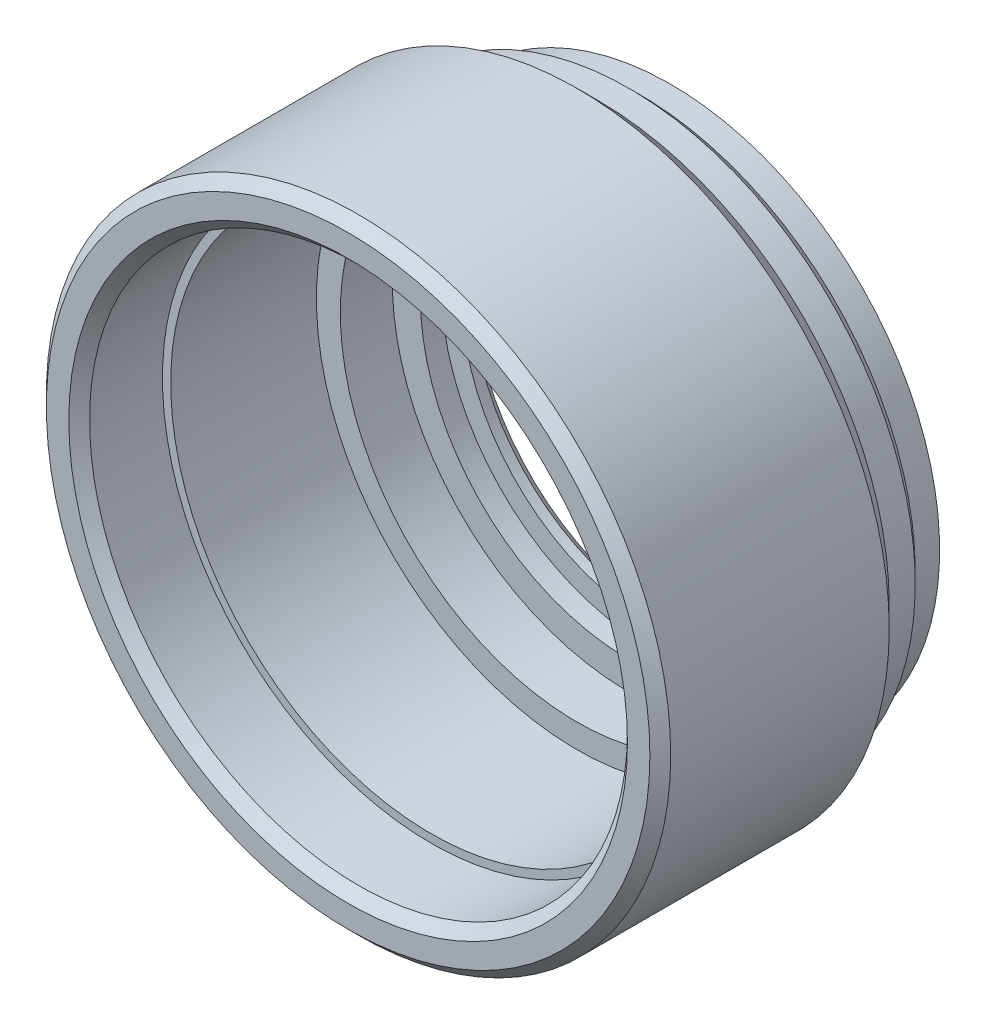
ISO-10303-21;
HEADER;
FILE_DESCRIPTION(('STEP AP214'),'2;1');
FILE_NAME('part.step','',(''),(''),'','','');
FILE_SCHEMA(('AUTOMOTIVE_DESIGN { 1 0 10303 214 1 1 1 1 }'));
ENDSEC;
DATA;
#1=APPLICATION_CONTEXT('core data for automotive mechanical design processes');
#2=APPLICATION_PROTOCOL_DEFINITION('international standard','automotive_design',2000,#1);
#3=PRODUCT_CONTEXT('',#1,'mechanical');
#4=PRODUCT('Part','Part','',(#3));
#5=PRODUCT_RELATED_PRODUCT_CATEGORY('part','',(#4));
#6=PRODUCT_DEFINITION_FORMATION('','',#4);
#7=PRODUCT_DEFINITION_CONTEXT('part definition',#1,'design');
#8=PRODUCT_DEFINITION('design','',#6,#7);
#9=PRODUCT_DEFINITION_SHAPE('','',#8);
#10=(LENGTH_UNIT() NAMED_UNIT(*) SI_UNIT(.MILLI.,.METRE.));
#11=(NAMED_UNIT(*) PLANE_ANGLE_UNIT() SI_UNIT($,.RADIAN.));
#12=(NAMED_UNIT(*) SI_UNIT($,.STERADIAN.) SOLID_ANGLE_UNIT());
#13=UNCERTAINTY_MEASURE_WITH_UNIT(LENGTH_MEASURE(1.E-05),#10,'distance_accuracy_value','');
#14=(GEOMETRIC_REPRESENTATION_CONTEXT(3) GLOBAL_UNCERTAINTY_ASSIGNED_CONTEXT((#13)) GLOBAL_UNIT_ASSIGNED_CONTEXT((#10,
#11,#12)) REPRESENTATION_CONTEXT('',''));
#15=CARTESIAN_POINT('',(0.,0.,0.));
#16=DIRECTION('',(0.,0.,1.));
#17=DIRECTION('',(1.,0.,0.));
#18=AXIS2_PLACEMENT_3D('',#15,#16,#17);
#19=CARTESIAN_POINT('',(0.,0.,7.));
#20=DIRECTION('',(0.,0.,-1.));
#21=DIRECTION('',(-1.,0.,0.));
#22=AXIS2_PLACEMENT_3D('',#19,#20,#21);
#23=CYLINDRICAL_SURFACE('',#22,27.5);
#24=CARTESIAN_POINT('',(0.,0.,3.99999999999999));
#25=DIRECTION('',(0.,0.,-1.));
#26=DIRECTION('',(-1.,0.,0.));
#27=AXIS2_PLACEMENT_3D('',#24,#25,#26);
#28=CIRCLE('',#27,27.5);
#29=CARTESIAN_POINT('',(-27.5,0.,3.99999999999999));
#30=VERTEX_POINT('',#29);
#31=EDGE_CURVE('E71',#30,#30,#28,.F.);
#32=ORIENTED_EDGE('',*,*,#31,.T.);
#33=EDGE_LOOP('',(#32));
#34=FACE_BOUND('',#33,.T.);
#35=CARTESIAN_POINT('',(0.,0.,7.));
#36=DIRECTION('',(0.,0.,1.));
#37=DIRECTION('',(1.,0.,0.));
#38=AXIS2_PLACEMENT_3D('',#35,#36,#37);
#39=CIRCLE('',#38,27.5);
#40=CARTESIAN_POINT('',(27.5,0.,7.));
#41=VERTEX_POINT('',#40);
#42=EDGE_CURVE('E86',#41,#41,#39,.T.);
#43=ORIENTED_EDGE('',*,*,#42,.F.);
#44=EDGE_LOOP('',(#43));
#45=FACE_BOUND('',#44,.T.);
#46=ADVANCED_FACE('F37',(#34,#45),#23,.T.);
#47=CARTESIAN_POINT('',(0.,0.,0.));
#48=DIRECTION('',(0.,0.,1.));
#49=DIRECTION('',(1.,0.,0.));
#50=AXIS2_PLACEMENT_3D('',#47,#48,#49);
#51=PLANE('',#50);
#52=CARTESIAN_POINT('',(0.,0.,0.));
#53=DIRECTION('',(0.,0.,1.));
#54=DIRECTION('',(1.,0.,0.));
#55=AXIS2_PLACEMENT_3D('',#52,#53,#54);
#56=CIRCLE('',#55,19.05);
#57=CARTESIAN_POINT('',(19.05,0.,0.));
#58=VERTEX_POINT('',#57);
#59=EDGE_CURVE('E67',#58,#58,#56,.T.);
#60=ORIENTED_EDGE('',*,*,#59,.T.);
#61=EDGE_LOOP('',(#60));
#62=FACE_BOUND('',#61,.T.);
#63=CARTESIAN_POINT('',(0.,0.,0.));
#64=DIRECTION('',(0.,0.,-1.));
#65=DIRECTION('',(-1.,0.,0.));
#66=AXIS2_PLACEMENT_3D('',#63,#64,#65);
#67=CIRCLE('',#66,25.8445);
#68=CARTESIAN_POINT('',(-25.8445,0.,0.));
#69=VERTEX_POINT('',#68);
#70=EDGE_CURVE('E122',#69,#69,#67,.T.);
#71=ORIENTED_EDGE('',*,*,#70,.T.);
#72=EDGE_LOOP('',(#71));
#73=FACE_BOUND('',#72,.T.);
#74=ADVANCED_FACE('F149',(#62,#73),#51,.F.);
#75=CARTESIAN_POINT('',(0.,0.,-63.8520994748921));
#76=DIRECTION('',(0.,0.,1.));
#77=DIRECTION('',(1.,0.,0.));
#78=AXIS2_PLACEMENT_3D('',#75,#76,#77);
#79=CYLINDRICAL_SURFACE('',#78,25.05);
#80=CARTESIAN_POINT('',(0.,0.,9.00000000000001));
#81=DIRECTION('',(0.,0.,1.));
#82=DIRECTION('',(1.,0.,0.));
#83=AXIS2_PLACEMENT_3D('',#80,#81,#82);
#84=CIRCLE('',#83,25.05);
#85=CARTESIAN_POINT('',(25.05,0.,9.00000000000001));
#86=VERTEX_POINT('',#85);
#87=EDGE_CURVE('E97',#86,#86,#84,.F.);
#88=ORIENTED_EDGE('',*,*,#87,.T.);
#89=EDGE_LOOP('',(#88));
#90=FACE_BOUND('',#89,.T.);
#91=CARTESIAN_POINT('',(0.,0.,23.));
#92=DIRECTION('',(0.,0.,1.));
#93=DIRECTION('',(1.,0.,0.));
#94=AXIS2_PLACEMENT_3D('',#91,#92,#93);
#95=CIRCLE('',#94,25.05);
#96=CARTESIAN_POINT('',(25.05,0.,23.));
#97=VERTEX_POINT('',#96);
#98=EDGE_CURVE('E87',#97,#97,#95,.F.);
#99=ORIENTED_EDGE('',*,*,#98,.F.);
#100=EDGE_LOOP('',(#99));
#101=FACE_BOUND('',#100,.T.);
#102=ADVANCED_FACE('F155',(#90,#101),#79,.F.);
#103=CARTESIAN_POINT('',(0.,0.,-56.7099638511611));
#104=DIRECTION('',(0.,0.,1.));
#105=DIRECTION('',(1.,0.,0.));
#106=AXIS2_PLACEMENT_3D('',#103,#104,#105);
#107=CYLINDRICAL_SURFACE('',#106,20.05);
#108=CARTESIAN_POINT('',(0.,0.,2.));
#109=DIRECTION('',(0.,0.,1.));
#110=DIRECTION('',(1.,0.,0.));
#111=AXIS2_PLACEMENT_3D('',#108,#109,#110);
#112=CIRCLE('',#111,20.05);
#113=CARTESIAN_POINT('',(20.05,0.,2.));
#114=VERTEX_POINT('',#113);
#115=EDGE_CURVE('E102',#114,#114,#112,.F.);
#116=ORIENTED_EDGE('',*,*,#115,.T.);
#117=EDGE_LOOP('',(#116));
#118=FACE_BOUND('',#117,.T.);
#119=CARTESIAN_POINT('',(0.,0.,4.));
#120=DIRECTION('',(0.,0.,1.));
#121=DIRECTION('',(1.,0.,0.));
#122=AXIS2_PLACEMENT_3D('',#119,#120,#121);
#123=CIRCLE('',#122,20.05);
#124=CARTESIAN_POINT('',(20.05,0.,4.));
#125=VERTEX_POINT('',#124);
#126=EDGE_CURVE('E93',#125,#125,#123,.F.);
#127=ORIENTED_EDGE('',*,*,#126,.F.);
#128=EDGE_LOOP('',(#127));
#129=FACE_BOUND('',#128,.T.);
#130=ADVANCED_FACE('F189',(#118,#129),#107,.F.);
#131=CARTESIAN_POINT('',(0.,0.,2.));
#132=DIRECTION('',(0.,0.,1.));
#133=DIRECTION('',(1.,0.,0.));
#134=AXIS2_PLACEMENT_3D('',#131,#132,#133);
#135=PLANE('',#134);
#136=CARTESIAN_POINT('',(0.,0.,2.));
#137=DIRECTION('',(0.,0.,1.));
#138=DIRECTION('',(1.,0.,0.));
#139=AXIS2_PLACEMENT_3D('',#136,#137,#138);
#140=CIRCLE('',#139,18.05);
#141=CARTESIAN_POINT('',(18.05,0.,2.));
#142=VERTEX_POINT('',#141);
#143=EDGE_CURVE('E106',#142,#142,#140,.T.);
#144=ORIENTED_EDGE('',*,*,#143,.F.);
#145=EDGE_LOOP('',(#144));
#146=FACE_BOUND('',#145,.T.);
#147=ORIENTED_EDGE('',*,*,#115,.F.);
#148=EDGE_LOOP('',(#147));
#149=FACE_BOUND('',#148,.T.);
#150=ADVANCED_FACE('F195',(#146,#149),#135,.T.);
#151=CARTESIAN_POINT('',(0.,0.,0.));
#152=DIRECTION('',(0.,0.,1.));
#153=DIRECTION('',(1.,0.,0.));
#154=AXIS2_PLACEMENT_3D('',#151,#152,#153);
#155=CYLINDRICAL_SURFACE('',#154,18.05);
#156=CARTESIAN_POINT('',(0.,0.,1.));
#157=DIRECTION('',(0.,0.,1.));
#158=DIRECTION('',(1.,0.,0.));
#159=AXIS2_PLACEMENT_3D('',#156,#157,#158);
#160=CIRCLE('',#159,18.05);
#161=CARTESIAN_POINT('',(18.05,0.,1.));
#162=VERTEX_POINT('',#161);
#163=EDGE_CURVE('E63',#162,#162,#160,.F.);
#164=ORIENTED_EDGE('',*,*,#163,.T.);
#165=EDGE_LOOP('',(#164));
#166=FACE_BOUND('',#165,.T.);
#167=ORIENTED_EDGE('',*,*,#143,.T.);
#168=EDGE_LOOP('',(#167));
#169=FACE_BOUND('',#168,.T.);
#170=ADVANCED_FACE('F205',(#166,#169),#155,.F.);
#171=CARTESIAN_POINT('',(0.,0.,31.));
#172=DIRECTION('',(0.,0.,1.));
#173=DIRECTION('',(1.,0.,0.));
#174=AXIS2_PLACEMENT_3D('',#171,#172,#173);
#175=PLANE('',#174);
#176=CARTESIAN_POINT('',(0.,0.,31.));
#177=DIRECTION('',(0.,0.,1.));
#178=DIRECTION('',(1.,0.,0.));
#179=AXIS2_PLACEMENT_3D('',#176,#177,#178);
#180=CIRCLE('',#179,26.8445);
#181=CARTESIAN_POINT('',(26.8445,0.,31.));
#182=VERTEX_POINT('',#181);
#183=EDGE_CURVE('E45',#182,#182,#180,.F.);
#184=ORIENTED_EDGE('',*,*,#183,.T.);
#185=EDGE_LOOP('',(#184));
#186=FACE_BOUND('',#185,.T.);
#187=CARTESIAN_POINT('',(0.,0.,31.));
#188=DIRECTION('',(0.,0.,1.));
#189=DIRECTION('',(1.,0.,0.));
#190=AXIS2_PLACEMENT_3D('',#187,#188,#189);
#191=CIRCLE('',#190,29.);
#192=CARTESIAN_POINT('',(29.,0.,31.));
#193=VERTEX_POINT('',#192);
#194=EDGE_CURVE('E52',#193,#193,#191,.T.);
#195=ORIENTED_EDGE('',*,*,#194,.T.);
#196=EDGE_LOOP('',(#195));
#197=FACE_BOUND('',#196,.T.);
#198=ADVANCED_FACE('F201',(#186,#197),#175,.T.);
#199=CARTESIAN_POINT('',(0.,0.,7.));
#200=DIRECTION('',(0.,0.,1.));
#201=DIRECTION('',(1.,0.,0.));
#202=AXIS2_PLACEMENT_3D('',#199,#200,#201);
#203=PLANE('',#202);
#204=CARTESIAN_POINT('',(0.,0.,7.));
#205=DIRECTION('',(0.,0.,1.));
#206=DIRECTION('',(1.,0.,0.));
#207=AXIS2_PLACEMENT_3D('',#204,#205,#206);
#208=CIRCLE('',#207,28.);
#209=CARTESIAN_POINT('',(28.,0.,7.));
#210=VERTEX_POINT('',#209);
#211=EDGE_CURVE('E79',#210,#210,#208,.F.);
#212=ORIENTED_EDGE('',*,*,#211,.T.);
#213=EDGE_LOOP('',(#212));
#214=FACE_BOUND('',#213,.T.);
#215=ORIENTED_EDGE('',*,*,#42,.T.);
#216=EDGE_LOOP('',(#215));
#217=FACE_BOUND('',#216,.T.);
#218=ADVANCED_FACE('F204',(#214,#217),#203,.F.);
#219=CARTESIAN_POINT('',(0.,0.,31.));
#220=DIRECTION('',(0.,0.,-1.));
#221=DIRECTION('',(-1.,0.,0.));
#222=AXIS2_PLACEMENT_3D('',#219,#220,#221);
#223=CYLINDRICAL_SURFACE('',#222,30.);
#224=CARTESIAN_POINT('',(0.,0.,30.));
#225=DIRECTION('',(0.,0.,1.));
#226=DIRECTION('',(1.,0.,0.));
#227=AXIS2_PLACEMENT_3D('',#224,#225,#226);
#228=CIRCLE('',#227,30.);
#229=CARTESIAN_POINT('',(30.,0.,30.));
#230=VERTEX_POINT('',#229);
#231=EDGE_CURVE('E12',#230,#230,#228,.F.);
#232=ORIENTED_EDGE('',*,*,#231,.T.);
#233=EDGE_LOOP('',(#232));
#234=FACE_BOUND('',#233,.T.);
#235=CARTESIAN_POINT('',(0.,0.,8.99999999999999));
#236=DIRECTION('',(0.,0.,1.));
#237=DIRECTION('',(1.,0.,0.));
#238=AXIS2_PLACEMENT_3D('',#235,#236,#237);
#239=CIRCLE('',#238,30.);
#240=CARTESIAN_POINT('',(30.,0.,8.99999999999999));
#241=VERTEX_POINT('',#240);
#242=EDGE_CURVE('E83',#241,#241,#239,.T.);
#243=ORIENTED_EDGE('',*,*,#242,.T.);
#244=EDGE_LOOP('',(#243));
#245=FACE_BOUND('',#244,.T.);
#246=ADVANCED_FACE('F208',(#234,#245),#223,.T.);
#247=CARTESIAN_POINT('',(0.,0.,9.));
#248=DIRECTION('',(0.,0.,1.));
#249=DIRECTION('',(1.,0.,0.));
#250=AXIS2_PLACEMENT_3D('',#247,#248,#249);
#251=PLANE('',#250);
#252=CARTESIAN_POINT('',(0.,0.,9.));
#253=DIRECTION('',(0.,0.,1.));
#254=DIRECTION('',(1.,0.,0.));
#255=AXIS2_PLACEMENT_3D('',#252,#253,#254);
#256=CIRCLE('',#255,22.75);
#257=CARTESIAN_POINT('',(22.75,0.,9.));
#258=VERTEX_POINT('',#257);
#259=EDGE_CURVE('E91',#258,#258,#256,.T.);
#260=ORIENTED_EDGE('',*,*,#259,.F.);
#261=EDGE_LOOP('',(#260));
#262=FACE_BOUND('',#261,.T.);
#263=ORIENTED_EDGE('',*,*,#87,.F.);
#264=EDGE_LOOP('',(#263));
#265=FACE_BOUND('',#264,.T.);
#266=ADVANCED_FACE('F199',(#262,#265),#251,.T.);
#267=CARTESIAN_POINT('',(0.,0.,4.));
#268=DIRECTION('',(0.,0.,1.));
#269=DIRECTION('',(1.,0.,0.));
#270=AXIS2_PLACEMENT_3D('',#267,#268,#269);
#271=PLANE('',#270);
#272=CARTESIAN_POINT('',(0.,0.,4.));
#273=DIRECTION('',(0.,0.,1.));
#274=DIRECTION('',(1.,0.,0.));
#275=AXIS2_PLACEMENT_3D('',#272,#273,#274);
#276=CIRCLE('',#275,22.75);
#277=CARTESIAN_POINT('',(22.75,0.,4.));
#278=VERTEX_POINT('',#277);
#279=EDGE_CURVE('E98',#278,#278,#276,.T.);
#280=ORIENTED_EDGE('',*,*,#279,.T.);
#281=EDGE_LOOP('',(#280));
#282=FACE_BOUND('',#281,.T.);
#283=ORIENTED_EDGE('',*,*,#126,.T.);
#284=EDGE_LOOP('',(#283));
#285=FACE_BOUND('',#284,.T.);
#286=ADVANCED_FACE('F225',(#282,#285),#271,.T.);
#287=CARTESIAN_POINT('',(0.,0.,4.));
#288=DIRECTION('',(0.,0.,1.));
#289=DIRECTION('',(1.,0.,0.));
#290=AXIS2_PLACEMENT_3D('',#287,#288,#289);
#291=CYLINDRICAL_SURFACE('',#290,22.75);
#292=ORIENTED_EDGE('',*,*,#279,.F.);
#293=EDGE_LOOP('',(#292));
#294=FACE_BOUND('',#293,.T.);
#295=ORIENTED_EDGE('',*,*,#259,.T.);
#296=EDGE_LOOP('',(#295));
#297=FACE_BOUND('',#296,.T.);
#298=ADVANCED_FACE('F185',(#294,#297),#291,.F.);
#299=CARTESIAN_POINT('',(0.,0.,23.));
#300=DIRECTION('',(0.,0.,1.));
#301=DIRECTION('',(1.,0.,0.));
#302=AXIS2_PLACEMENT_3D('',#299,#300,#301);
#303=PLANE('',#302);
#304=CARTESIAN_POINT('',(0.,0.,23.));
#305=DIRECTION('',(0.,0.,1.));
#306=DIRECTION('',(1.,0.,0.));
#307=AXIS2_PLACEMENT_3D('',#304,#305,#306);
#308=CIRCLE('',#307,25.8445);
#309=CARTESIAN_POINT('',(25.8445,0.,23.));
#310=VERTEX_POINT('',#309);
#311=EDGE_CURVE('E92',#310,#310,#308,.T.);
#312=ORIENTED_EDGE('',*,*,#311,.T.);
#313=EDGE_LOOP('',(#312));
#314=FACE_BOUND('',#313,.T.);
#315=ORIENTED_EDGE('',*,*,#98,.T.);
#316=EDGE_LOOP('',(#315));
#317=FACE_BOUND('',#316,.T.);
#318=ADVANCED_FACE('F144',(#314,#317),#303,.T.);
#319=CARTESIAN_POINT('',(0.,0.,23.));
#320=DIRECTION('',(0.,0.,1.));
#321=DIRECTION('',(1.,0.,0.));
#322=AXIS2_PLACEMENT_3D('',#319,#320,#321);
#323=CYLINDRICAL_SURFACE('',#322,25.8445);
#324=CARTESIAN_POINT('',(0.,0.,30.));
#325=DIRECTION('',(0.,0.,1.));
#326=DIRECTION('',(1.,0.,0.));
#327=AXIS2_PLACEMENT_3D('',#324,#325,#326);
#328=CIRCLE('',#327,25.8445);
#329=CARTESIAN_POINT('',(25.8445,0.,30.));
#330=VERTEX_POINT('',#329);
#331=EDGE_CURVE('E57',#330,#330,#328,.T.);
#332=ORIENTED_EDGE('',*,*,#331,.T.);
#333=EDGE_LOOP('',(#332));
#334=FACE_BOUND('',#333,.T.);
#335=ORIENTED_EDGE('',*,*,#311,.F.);
#336=EDGE_LOOP('',(#335));
#337=FACE_BOUND('',#336,.T.);
#338=ADVANCED_FACE('F135',(#334,#337),#323,.F.);
#339=CARTESIAN_POINT('',(0.,0.,3.));
#340=DIRECTION('',(0.,0.,-1.));
#341=DIRECTION('',(-1.,0.,0.));
#342=AXIS2_PLACEMENT_3D('',#339,#340,#341);
#343=PLANE('',#342);
#344=CARTESIAN_POINT('',(0.,0.,3.));
#345=DIRECTION('',(0.,0.,-1.));
#346=DIRECTION('',(-1.,0.,0.));
#347=AXIS2_PLACEMENT_3D('',#344,#345,#346);
#348=CIRCLE('',#347,26.5);
#349=CARTESIAN_POINT('',(-26.5,0.,3.));
#350=VERTEX_POINT('',#349);
#351=EDGE_CURVE('E75',#350,#350,#348,.T.);
#352=ORIENTED_EDGE('',*,*,#351,.T.);
#353=EDGE_LOOP('',(#352));
#354=FACE_BOUND('',#353,.T.);
#355=CARTESIAN_POINT('',(0.,0.,3.));
#356=DIRECTION('',(0.,0.,-1.));
#357=DIRECTION('',(-1.,0.,0.));
#358=AXIS2_PLACEMENT_3D('',#355,#356,#357);
#359=CIRCLE('',#358,25.8445);
#360=CARTESIAN_POINT('',(-25.8445,0.,3.));
#361=VERTEX_POINT('',#360);
#362=EDGE_CURVE('E121',#361,#361,#359,.T.);
#363=ORIENTED_EDGE('',*,*,#362,.F.);
#364=EDGE_LOOP('',(#363));
#365=FACE_BOUND('',#364,.T.);
#366=ADVANCED_FACE('F133',(#354,#365),#343,.T.);
#367=CARTESIAN_POINT('',(0.,0.,3.));
#368=DIRECTION('',(0.,0.,-1.));
#369=DIRECTION('',(-1.,0.,0.));
#370=AXIS2_PLACEMENT_3D('',#367,#368,#369);
#371=CYLINDRICAL_SURFACE('',#370,25.8445);
#372=ORIENTED_EDGE('',*,*,#362,.T.);
#373=EDGE_LOOP('',(#372));
#374=FACE_BOUND('',#373,.T.);
#375=ORIENTED_EDGE('',*,*,#70,.F.);
#376=EDGE_LOOP('',(#375));
#377=FACE_BOUND('',#376,.T.);
#378=ADVANCED_FACE('F130',(#374,#377),#371,.T.);
#379=CARTESIAN_POINT('',(0.,0.,8.99999999999999));
#380=DIRECTION('',(0.,0.,1.));
#381=DIRECTION('',(1.,0.,0.));
#382=AXIS2_PLACEMENT_3D('',#379,#380,#381);
#383=CONICAL_SURFACE('',#382,30.,0.78539816339745);
#384=ORIENTED_EDGE('',*,*,#211,.F.);
#385=EDGE_LOOP('',(#384));
#386=FACE_BOUND('',#385,.T.);
#387=ORIENTED_EDGE('',*,*,#242,.F.);
#388=EDGE_LOOP('',(#387));
#389=FACE_BOUND('',#388,.T.);
#390=ADVANCED_FACE('F142',(#386,#389),#383,.T.);
#391=CARTESIAN_POINT('',(0.,0.,3.));
#392=DIRECTION('',(0.,0.,1.));
#393=DIRECTION('',(1.,0.,0.));
#394=AXIS2_PLACEMENT_3D('',#391,#392,#393);
#395=CONICAL_SURFACE('',#394,26.5,0.785398163397443);
#396=ORIENTED_EDGE('',*,*,#31,.F.);
#397=EDGE_LOOP('',(#396));
#398=FACE_BOUND('',#397,.T.);
#399=ORIENTED_EDGE('',*,*,#351,.F.);
#400=EDGE_LOOP('',(#399));
#401=FACE_BOUND('',#400,.T.);
#402=ADVANCED_FACE('F163',(#398,#401),#395,.T.);
#403=CARTESIAN_POINT('',(0.,0.,0.));
#404=DIRECTION('',(0.,0.,-1.));
#405=DIRECTION('',(-1.,0.,0.));
#406=AXIS2_PLACEMENT_3D('',#403,#404,#405);
#407=CONICAL_SURFACE('',#406,19.05,0.785398163397448);
#408=ORIENTED_EDGE('',*,*,#163,.F.);
#409=EDGE_LOOP('',(#408));
#410=FACE_BOUND('',#409,.T.);
#411=ORIENTED_EDGE('',*,*,#59,.F.);
#412=EDGE_LOOP('',(#411));
#413=FACE_BOUND('',#412,.T.);
#414=ADVANCED_FACE('F167',(#410,#413),#407,.F.);
#415=CARTESIAN_POINT('',(0.,0.,30.));
#416=DIRECTION('',(0.,0.,1.));
#417=DIRECTION('',(1.,0.,0.));
#418=AXIS2_PLACEMENT_3D('',#415,#416,#417);
#419=CONICAL_SURFACE('',#418,25.8445,0.785398163397445);
#420=ORIENTED_EDGE('',*,*,#183,.F.);
#421=EDGE_LOOP('',(#420));
#422=FACE_BOUND('',#421,.T.);
#423=ORIENTED_EDGE('',*,*,#331,.F.);
#424=EDGE_LOOP('',(#423));
#425=FACE_BOUND('',#424,.T.);
#426=ADVANCED_FACE('F170',(#422,#425),#419,.F.);
#427=CARTESIAN_POINT('',(0.,0.,31.));
#428=DIRECTION('',(0.,0.,-1.));
#429=DIRECTION('',(-1.,0.,0.));
#430=AXIS2_PLACEMENT_3D('',#427,#428,#429);
#431=CONICAL_SURFACE('',#430,29.,0.785398163397447);
#432=ORIENTED_EDGE('',*,*,#231,.F.);
#433=EDGE_LOOP('',(#432));
#434=FACE_BOUND('',#433,.T.);
#435=ORIENTED_EDGE('',*,*,#194,.F.);
#436=EDGE_LOOP('',(#435));
#437=FACE_BOUND('',#436,.T.);
#438=ADVANCED_FACE('F39',(#434,#437),#431,.T.);
#439=CLOSED_SHELL('',(#46,#74,#102,#130,#150,#170,#198,#218,#246,#266,#286,#298,#318,#338,#366,
#378,#390,#402,#414,#426,#438));
#440=MANIFOLD_SOLID_BREP('B2',#439);
#441=ADVANCED_BREP_SHAPE_REPRESENTATION('',(#18,#440),#14);
#442=SHAPE_DEFINITION_REPRESENTATION(#9,#441);
ENDSEC;
END-ISO-10303-21;
